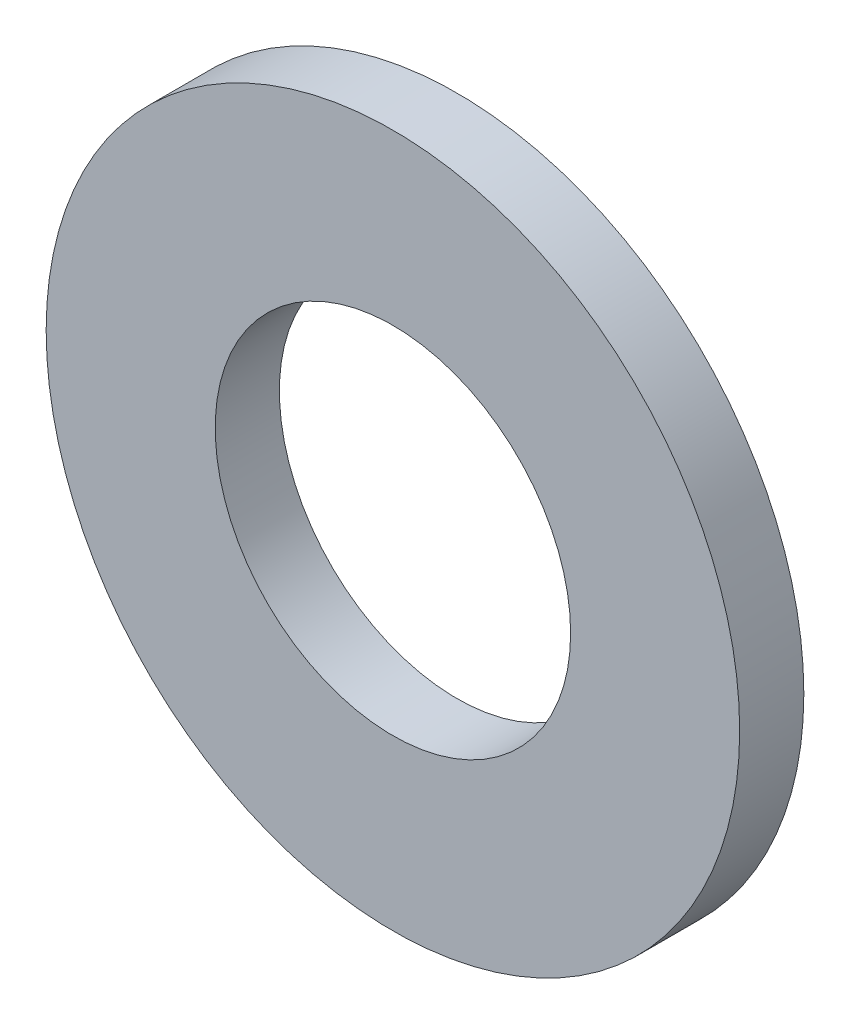
ISO-10303-21;
HEADER;
FILE_DESCRIPTION(('STEP AP214'),'2;1');
FILE_NAME('part.step','',(''),(''),'','','');
FILE_SCHEMA(('AUTOMOTIVE_DESIGN { 1 0 10303 214 1 1 1 1 }'));
ENDSEC;
DATA;
#1=APPLICATION_CONTEXT('core data for automotive mechanical design processes');
#2=APPLICATION_PROTOCOL_DEFINITION('international standard','automotive_design',2000,#1);
#3=PRODUCT_CONTEXT('',#1,'mechanical');
#4=PRODUCT('Part','Part','',(#3));
#5=PRODUCT_RELATED_PRODUCT_CATEGORY('part','',(#4));
#6=PRODUCT_DEFINITION_FORMATION('','',#4);
#7=PRODUCT_DEFINITION_CONTEXT('part definition',#1,'design');
#8=PRODUCT_DEFINITION('design','',#6,#7);
#9=PRODUCT_DEFINITION_SHAPE('','',#8);
#10=(LENGTH_UNIT() NAMED_UNIT(*) SI_UNIT(.MILLI.,.METRE.));
#11=(NAMED_UNIT(*) PLANE_ANGLE_UNIT() SI_UNIT($,.RADIAN.));
#12=(NAMED_UNIT(*) SI_UNIT($,.STERADIAN.) SOLID_ANGLE_UNIT());
#13=UNCERTAINTY_MEASURE_WITH_UNIT(LENGTH_MEASURE(1.E-05),#10,'distance_accuracy_value','');
#14=(GEOMETRIC_REPRESENTATION_CONTEXT(3) GLOBAL_UNCERTAINTY_ASSIGNED_CONTEXT((#13)) GLOBAL_UNIT_ASSIGNED_CONTEXT((#10,
#11,#12)) REPRESENTATION_CONTEXT('',''));
#15=CARTESIAN_POINT('',(0.,0.,0.));
#16=DIRECTION('',(0.,0.,1.));
#17=DIRECTION('',(1.,0.,0.));
#18=AXIS2_PLACEMENT_3D('',#15,#16,#17);
#19=CARTESIAN_POINT('',(0.,0.,4.699));
#20=DIRECTION('',(0.,0.,1.));
#21=DIRECTION('',(1.,0.,0.));
#22=AXIS2_PLACEMENT_3D('',#19,#20,#21);
#23=PLANE('',#22);
#24=CARTESIAN_POINT('',(0.,0.,4.699));
#25=DIRECTION('',(0.,0.,1.));
#26=DIRECTION('',(1.,0.,0.));
#27=AXIS2_PLACEMENT_3D('',#24,#25,#26);
#28=CIRCLE('',#27,25.4);
#29=CARTESIAN_POINT('',(25.4,0.,4.699));
#30=VERTEX_POINT('',#29);
#31=EDGE_CURVE('E10',#30,#30,#28,.T.);
#32=ORIENTED_EDGE('',*,*,#31,.T.);
#33=EDGE_LOOP('',(#32));
#34=FACE_BOUND('',#33,.T.);
#35=CARTESIAN_POINT('',(0.,0.,4.699));
#36=DIRECTION('',(0.,0.,1.));
#37=DIRECTION('',(1.,0.,0.));
#38=AXIS2_PLACEMENT_3D('',#35,#36,#37);
#39=CIRCLE('',#38,13.0175);
#40=CARTESIAN_POINT('',(13.0175,0.,4.699));
#41=VERTEX_POINT('',#40);
#42=EDGE_CURVE('E43',#41,#41,#39,.T.);
#43=ORIENTED_EDGE('',*,*,#42,.F.);
#44=EDGE_LOOP('',(#43));
#45=FACE_BOUND('',#44,.T.);
#46=ADVANCED_FACE('F32',(#34,#45),#23,.T.);
#47=CARTESIAN_POINT('',(0.,0.,0.));
#48=DIRECTION('',(0.,0.,1.));
#49=DIRECTION('',(1.,0.,0.));
#50=AXIS2_PLACEMENT_3D('',#47,#48,#49);
#51=PLANE('',#50);
#52=CARTESIAN_POINT('',(0.,0.,0.));
#53=DIRECTION('',(0.,0.,1.));
#54=DIRECTION('',(1.,0.,0.));
#55=AXIS2_PLACEMENT_3D('',#52,#53,#54);
#56=CIRCLE('',#55,25.4);
#57=CARTESIAN_POINT('',(25.4,0.,0.));
#58=VERTEX_POINT('',#57);
#59=EDGE_CURVE('E36',#58,#58,#56,.T.);
#60=ORIENTED_EDGE('',*,*,#59,.F.);
#61=EDGE_LOOP('',(#60));
#62=FACE_BOUND('',#61,.T.);
#63=CARTESIAN_POINT('',(0.,0.,0.));
#64=DIRECTION('',(0.,0.,1.));
#65=DIRECTION('',(1.,0.,0.));
#66=AXIS2_PLACEMENT_3D('',#63,#64,#65);
#67=CIRCLE('',#66,13.0175);
#68=CARTESIAN_POINT('',(13.0175,0.,0.));
#69=VERTEX_POINT('',#68);
#70=EDGE_CURVE('E45',#69,#69,#67,.T.);
#71=ORIENTED_EDGE('',*,*,#70,.T.);
#72=EDGE_LOOP('',(#71));
#73=FACE_BOUND('',#72,.T.);
#74=ADVANCED_FACE('F55',(#62,#73),#51,.F.);
#75=CARTESIAN_POINT('',(0.,0.,4.699));
#76=DIRECTION('',(0.,0.,-1.));
#77=DIRECTION('',(-1.,0.,0.));
#78=AXIS2_PLACEMENT_3D('',#75,#76,#77);
#79=CYLINDRICAL_SURFACE('',#78,25.4);
#80=ORIENTED_EDGE('',*,*,#31,.F.);
#81=EDGE_LOOP('',(#80));
#82=FACE_BOUND('',#81,.T.);
#83=ORIENTED_EDGE('',*,*,#59,.T.);
#84=EDGE_LOOP('',(#83));
#85=FACE_BOUND('',#84,.T.);
#86=ADVANCED_FACE('F34',(#82,#85),#79,.T.);
#87=CARTESIAN_POINT('',(0.,0.,4.699));
#88=DIRECTION('',(0.,0.,-1.));
#89=DIRECTION('',(-1.,0.,0.));
#90=AXIS2_PLACEMENT_3D('',#87,#88,#89);
#91=CYLINDRICAL_SURFACE('',#90,13.0175);
#92=ORIENTED_EDGE('',*,*,#42,.T.);
#93=EDGE_LOOP('',(#92));
#94=FACE_BOUND('',#93,.T.);
#95=ORIENTED_EDGE('',*,*,#70,.F.);
#96=EDGE_LOOP('',(#95));
#97=FACE_BOUND('',#96,.T.);
#98=ADVANCED_FACE('F51',(#94,#97),#91,.F.);
#99=CLOSED_SHELL('',(#46,#74,#86,#98));
#100=MANIFOLD_SOLID_BREP('B2',#99);
#101=ADVANCED_BREP_SHAPE_REPRESENTATION('',(#18,#100),#14);
#102=SHAPE_DEFINITION_REPRESENTATION(#9,#101);
ENDSEC;
END-ISO-10303-21;
